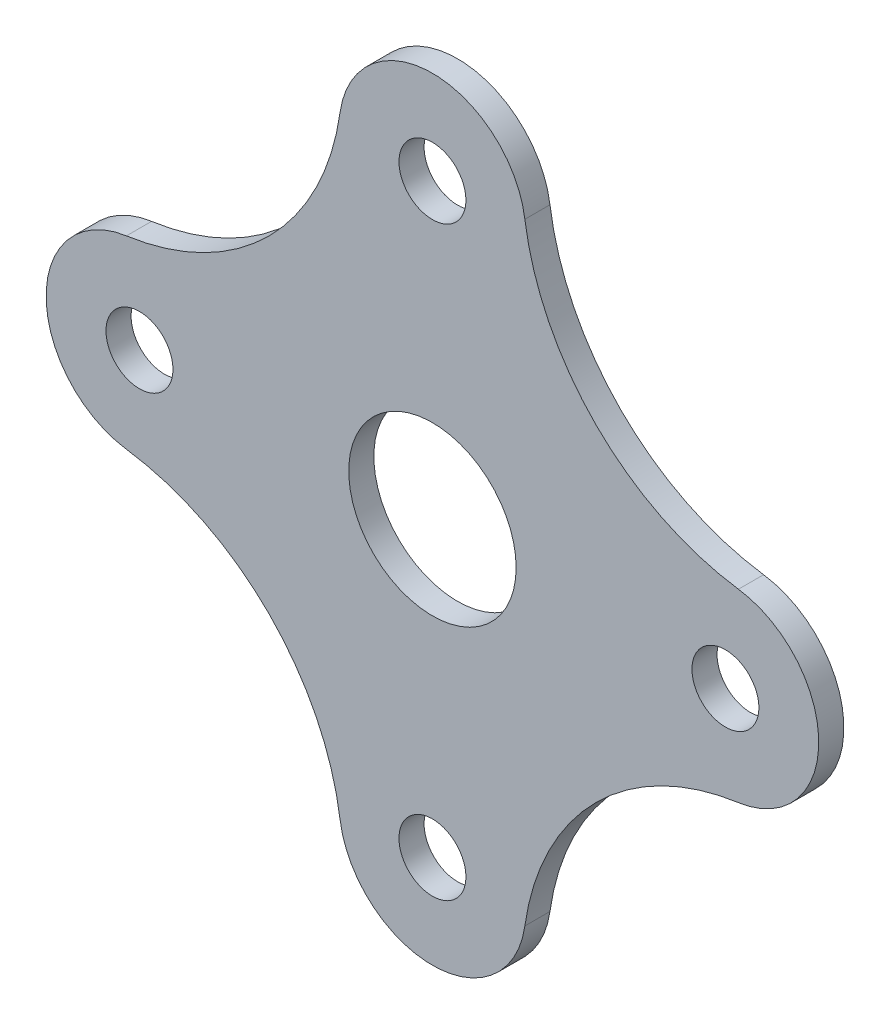
ISO-10303-21;
HEADER;
FILE_DESCRIPTION(('STEP AP214'),'2;1');
FILE_NAME('part.step','',(''),(''),'','','');
FILE_SCHEMA(('AUTOMOTIVE_DESIGN { 1 0 10303 214 1 1 1 1 }'));
ENDSEC;
DATA;
#1=APPLICATION_CONTEXT('core data for automotive mechanical design processes');
#2=APPLICATION_PROTOCOL_DEFINITION('international standard','automotive_design',2000,#1);
#3=PRODUCT_CONTEXT('',#1,'mechanical');
#4=PRODUCT('Part','Part','',(#3));
#5=PRODUCT_RELATED_PRODUCT_CATEGORY('part','',(#4));
#6=PRODUCT_DEFINITION_FORMATION('','',#4);
#7=PRODUCT_DEFINITION_CONTEXT('part definition',#1,'design');
#8=PRODUCT_DEFINITION('design','',#6,#7);
#9=PRODUCT_DEFINITION_SHAPE('','',#8);
#10=(LENGTH_UNIT() NAMED_UNIT(*) SI_UNIT(.MILLI.,.METRE.));
#11=(NAMED_UNIT(*) PLANE_ANGLE_UNIT() SI_UNIT($,.RADIAN.));
#12=(NAMED_UNIT(*) SI_UNIT($,.STERADIAN.) SOLID_ANGLE_UNIT());
#13=UNCERTAINTY_MEASURE_WITH_UNIT(LENGTH_MEASURE(1.E-05),#10,'distance_accuracy_value','');
#14=(GEOMETRIC_REPRESENTATION_CONTEXT(3) GLOBAL_UNCERTAINTY_ASSIGNED_CONTEXT((#13)) GLOBAL_UNIT_ASSIGNED_CONTEXT((#10,
#11,#12)) REPRESENTATION_CONTEXT('',''));
#15=CARTESIAN_POINT('',(0.,0.,0.));
#16=DIRECTION('',(0.,0.,1.));
#17=DIRECTION('',(1.,0.,0.));
#18=AXIS2_PLACEMENT_3D('',#15,#16,#17);
#19=CARTESIAN_POINT('',(0.,-35.,3.));
#20=DIRECTION('',(0.,0.,1.));
#21=DIRECTION('',(1.,0.,0.));
#22=AXIS2_PLACEMENT_3D('',#19,#20,#21);
#23=PLANE('',#22);
#24=CARTESIAN_POINT('',(0.,-35.,3.));
#25=DIRECTION('',(0.,0.,1.));
#26=DIRECTION('',(1.,0.,0.));
#27=AXIS2_PLACEMENT_3D('',#24,#25,#26);
#28=CIRCLE('',#27,4.);
#29=CARTESIAN_POINT('',(4.,-35.,3.));
#30=VERTEX_POINT('',#29);
#31=EDGE_CURVE('E196',#30,#30,#28,.T.);
#32=ORIENTED_EDGE('',*,*,#31,.F.);
#33=EDGE_LOOP('',(#32));
#34=FACE_BOUND('',#33,.T.);
#35=CARTESIAN_POINT('',(35.,0.,3.));
#36=DIRECTION('',(0.,0.,1.));
#37=DIRECTION('',(1.,0.,0.));
#38=AXIS2_PLACEMENT_3D('',#35,#36,#37);
#39=CIRCLE('',#38,4.00000000000001);
#40=CARTESIAN_POINT('',(39.,0.,3.));
#41=VERTEX_POINT('',#40);
#42=EDGE_CURVE('E185',#41,#41,#39,.T.);
#43=ORIENTED_EDGE('',*,*,#42,.F.);
#44=EDGE_LOOP('',(#43));
#45=FACE_BOUND('',#44,.T.);
#46=CARTESIAN_POINT('',(-35.,0.,3.));
#47=DIRECTION('',(0.,0.,1.));
#48=DIRECTION('',(1.,0.,0.));
#49=AXIS2_PLACEMENT_3D('',#46,#47,#48);
#50=CIRCLE('',#49,11.1495844875346);
#51=CARTESIAN_POINT('',(-36.5569960811462,11.040335024263,3.));
#52=VERTEX_POINT('',#51);
#53=CARTESIAN_POINT('',(-36.5569960811462,-11.040335024263,3.));
#54=VERTEX_POINT('',#53);
#55=EDGE_CURVE('E120',#52,#54,#50,.T.);
#56=ORIENTED_EDGE('',*,*,#55,.T.);
#57=CARTESIAN_POINT('',(-40.7463793255719,-40.7463793255719,3.));
#58=DIRECTION('',(0.,0.,1.));
#59=DIRECTION('',(1.,0.,0.));
#60=AXIS2_PLACEMENT_3D('',#57,#58,#59);
#61=CIRCLE('',#60,30.);
#62=CARTESIAN_POINT('',(-11.040335024263,-36.5569960811462,3.));
#63=VERTEX_POINT('',#62);
#64=EDGE_CURVE('E11',#54,#63,#61,.F.);
#65=ORIENTED_EDGE('',*,*,#64,.T.);
#66=CARTESIAN_POINT('',(0.,-35.,3.));
#67=DIRECTION('',(0.,0.,1.));
#68=DIRECTION('',(1.,0.,0.));
#69=AXIS2_PLACEMENT_3D('',#66,#67,#68);
#70=CIRCLE('',#69,11.1495844875346);
#71=CARTESIAN_POINT('',(11.040335024263,-36.5569960811462,3.));
#72=VERTEX_POINT('',#71);
#73=EDGE_CURVE('E127',#63,#72,#70,.T.);
#74=ORIENTED_EDGE('',*,*,#73,.T.);
#75=CARTESIAN_POINT('',(40.7463793255719,-40.7463793255719,3.));
#76=DIRECTION('',(0.,0.,1.));
#77=DIRECTION('',(1.,0.,0.));
#78=AXIS2_PLACEMENT_3D('',#75,#76,#77);
#79=CIRCLE('',#78,30.);
#80=CARTESIAN_POINT('',(36.5569960811462,-11.040335024263,3.));
#81=VERTEX_POINT('',#80);
#82=EDGE_CURVE('E156',#72,#81,#79,.F.);
#83=ORIENTED_EDGE('',*,*,#82,.T.);
#84=CARTESIAN_POINT('',(35.,0.,3.));
#85=DIRECTION('',(0.,0.,1.));
#86=DIRECTION('',(1.,0.,0.));
#87=AXIS2_PLACEMENT_3D('',#84,#85,#86);
#88=CIRCLE('',#87,11.1495844875346);
#89=CARTESIAN_POINT('',(36.5569960811462,11.040335024263,3.));
#90=VERTEX_POINT('',#89);
#91=EDGE_CURVE('E130',#81,#90,#88,.T.);
#92=ORIENTED_EDGE('',*,*,#91,.T.);
#93=CARTESIAN_POINT('',(40.7463793255719,40.7463793255719,3.));
#94=DIRECTION('',(0.,0.,1.));
#95=DIRECTION('',(1.,0.,0.));
#96=AXIS2_PLACEMENT_3D('',#93,#94,#95);
#97=CIRCLE('',#96,30.);
#98=CARTESIAN_POINT('',(11.040335024263,36.5569960811462,3.));
#99=VERTEX_POINT('',#98);
#100=EDGE_CURVE('E152',#90,#99,#97,.F.);
#101=ORIENTED_EDGE('',*,*,#100,.T.);
#102=CARTESIAN_POINT('',(0.,35.,3.));
#103=DIRECTION('',(0.,0.,1.));
#104=DIRECTION('',(1.,0.,0.));
#105=AXIS2_PLACEMENT_3D('',#102,#103,#104);
#106=CIRCLE('',#105,11.1495844875346);
#107=CARTESIAN_POINT('',(-11.040335024263,36.5569960811462,3.));
#108=VERTEX_POINT('',#107);
#109=EDGE_CURVE('E169',#99,#108,#106,.T.);
#110=ORIENTED_EDGE('',*,*,#109,.T.);
#111=CARTESIAN_POINT('',(-40.7463793255719,40.7463793255719,3.));
#112=DIRECTION('',(0.,0.,1.));
#113=DIRECTION('',(1.,0.,0.));
#114=AXIS2_PLACEMENT_3D('',#111,#112,#113);
#115=CIRCLE('',#114,30.);
#116=EDGE_CURVE('E112',#108,#52,#115,.F.);
#117=ORIENTED_EDGE('',*,*,#116,.T.);
#118=EDGE_LOOP('',(#56,#65,#74,#83,#92,#101,#110,#117));
#119=FACE_BOUND('',#118,.T.);
#120=CARTESIAN_POINT('',(-35.,0.,3.));
#121=DIRECTION('',(0.,0.,1.));
#122=DIRECTION('',(1.,0.,0.));
#123=AXIS2_PLACEMENT_3D('',#120,#121,#122);
#124=CIRCLE('',#123,4.00000000000001);
#125=CARTESIAN_POINT('',(-31.,0.,3.));
#126=VERTEX_POINT('',#125);
#127=EDGE_CURVE('E175',#126,#126,#124,.T.);
#128=ORIENTED_EDGE('',*,*,#127,.F.);
#129=EDGE_LOOP('',(#128));
#130=FACE_BOUND('',#129,.T.);
#131=CARTESIAN_POINT('',(0.,35.,3.));
#132=DIRECTION('',(0.,0.,1.));
#133=DIRECTION('',(1.,0.,0.));
#134=AXIS2_PLACEMENT_3D('',#131,#132,#133);
#135=CIRCLE('',#134,4.);
#136=CARTESIAN_POINT('',(3.99999999999999,35.,3.));
#137=VERTEX_POINT('',#136);
#138=EDGE_CURVE('E190',#137,#137,#135,.T.);
#139=ORIENTED_EDGE('',*,*,#138,.F.);
#140=EDGE_LOOP('',(#139));
#141=FACE_BOUND('',#140,.T.);
#142=CARTESIAN_POINT('',(0.,0.,3.));
#143=DIRECTION('',(0.,0.,1.));
#144=DIRECTION('',(1.,0.,0.));
#145=AXIS2_PLACEMENT_3D('',#142,#143,#144);
#146=CIRCLE('',#145,10.);
#147=CARTESIAN_POINT('',(9.99999999999999,0.,3.));
#148=VERTEX_POINT('',#147);
#149=EDGE_CURVE('E202',#148,#148,#146,.T.);
#150=ORIENTED_EDGE('',*,*,#149,.F.);
#151=EDGE_LOOP('',(#150));
#152=FACE_BOUND('',#151,.T.);
#153=ADVANCED_FACE('F37',(#34,#45,#119,#130,#141,#152),#23,.T.);
#154=CARTESIAN_POINT('',(0.,-35.,0.));
#155=DIRECTION('',(0.,0.,1.));
#156=DIRECTION('',(1.,0.,0.));
#157=AXIS2_PLACEMENT_3D('',#154,#155,#156);
#158=PLANE('',#157);
#159=CARTESIAN_POINT('',(0.,-35.,0.));
#160=DIRECTION('',(0.,0.,1.));
#161=DIRECTION('',(1.,0.,0.));
#162=AXIS2_PLACEMENT_3D('',#159,#160,#161);
#163=CIRCLE('',#162,11.1495844875346);
#164=CARTESIAN_POINT('',(-11.040335024263,-36.5569960811462,0.));
#165=VERTEX_POINT('',#164);
#166=CARTESIAN_POINT('',(11.040335024263,-36.5569960811462,0.));
#167=VERTEX_POINT('',#166);
#168=EDGE_CURVE('E172',#165,#167,#163,.T.);
#169=ORIENTED_EDGE('',*,*,#168,.F.);
#170=CARTESIAN_POINT('',(-40.7463793255719,-40.7463793255719,0.));
#171=DIRECTION('',(0.,0.,1.));
#172=DIRECTION('',(1.,0.,0.));
#173=AXIS2_PLACEMENT_3D('',#170,#171,#172);
#174=CIRCLE('',#173,30.);
#175=CARTESIAN_POINT('',(-36.5569960811462,-11.040335024263,0.));
#176=VERTEX_POINT('',#175);
#177=EDGE_CURVE('E45',#165,#176,#174,.T.);
#178=ORIENTED_EDGE('',*,*,#177,.T.);
#179=CARTESIAN_POINT('',(-35.,0.,0.));
#180=DIRECTION('',(0.,0.,1.));
#181=DIRECTION('',(1.,0.,0.));
#182=AXIS2_PLACEMENT_3D('',#179,#180,#181);
#183=CIRCLE('',#182,11.1495844875346);
#184=CARTESIAN_POINT('',(-36.5569960811462,11.040335024263,0.));
#185=VERTEX_POINT('',#184);
#186=EDGE_CURVE('E118',#185,#176,#183,.T.);
#187=ORIENTED_EDGE('',*,*,#186,.F.);
#188=CARTESIAN_POINT('',(-40.7463793255719,40.7463793255719,0.));
#189=DIRECTION('',(0.,0.,1.));
#190=DIRECTION('',(1.,0.,0.));
#191=AXIS2_PLACEMENT_3D('',#188,#189,#190);
#192=CIRCLE('',#191,30.);
#193=CARTESIAN_POINT('',(-11.040335024263,36.5569960811462,0.));
#194=VERTEX_POINT('',#193);
#195=EDGE_CURVE('E102',#185,#194,#192,.T.);
#196=ORIENTED_EDGE('',*,*,#195,.T.);
#197=CARTESIAN_POINT('',(0.,35.,0.));
#198=DIRECTION('',(0.,0.,1.));
#199=DIRECTION('',(1.,0.,0.));
#200=AXIS2_PLACEMENT_3D('',#197,#198,#199);
#201=CIRCLE('',#200,11.1495844875346);
#202=CARTESIAN_POINT('',(11.040335024263,36.5569960811462,0.));
#203=VERTEX_POINT('',#202);
#204=EDGE_CURVE('E128',#203,#194,#201,.T.);
#205=ORIENTED_EDGE('',*,*,#204,.F.);
#206=CARTESIAN_POINT('',(40.7463793255719,40.7463793255719,0.));
#207=DIRECTION('',(0.,0.,1.));
#208=DIRECTION('',(1.,0.,0.));
#209=AXIS2_PLACEMENT_3D('',#206,#207,#208);
#210=CIRCLE('',#209,30.);
#211=CARTESIAN_POINT('',(36.5569960811462,11.040335024263,0.));
#212=VERTEX_POINT('',#211);
#213=EDGE_CURVE('E150',#203,#212,#210,.T.);
#214=ORIENTED_EDGE('',*,*,#213,.T.);
#215=CARTESIAN_POINT('',(35.,0.,0.));
#216=DIRECTION('',(0.,0.,1.));
#217=DIRECTION('',(1.,0.,0.));
#218=AXIS2_PLACEMENT_3D('',#215,#216,#217);
#219=CIRCLE('',#218,11.1495844875346);
#220=CARTESIAN_POINT('',(36.5569960811462,-11.040335024263,0.));
#221=VERTEX_POINT('',#220);
#222=EDGE_CURVE('E132',#221,#212,#219,.T.);
#223=ORIENTED_EDGE('',*,*,#222,.F.);
#224=CARTESIAN_POINT('',(40.7463793255719,-40.7463793255719,0.));
#225=DIRECTION('',(0.,0.,1.));
#226=DIRECTION('',(1.,0.,0.));
#227=AXIS2_PLACEMENT_3D('',#224,#225,#226);
#228=CIRCLE('',#227,30.);
#229=EDGE_CURVE('E154',#221,#167,#228,.T.);
#230=ORIENTED_EDGE('',*,*,#229,.T.);
#231=EDGE_LOOP('',(#169,#178,#187,#196,#205,#214,#223,#230));
#232=FACE_BOUND('',#231,.T.);
#233=CARTESIAN_POINT('',(-35.,0.,0.));
#234=DIRECTION('',(0.,0.,1.));
#235=DIRECTION('',(1.,0.,0.));
#236=AXIS2_PLACEMENT_3D('',#233,#234,#235);
#237=CIRCLE('',#236,4.00000000000001);
#238=CARTESIAN_POINT('',(-31.,0.,0.));
#239=VERTEX_POINT('',#238);
#240=EDGE_CURVE('E178',#239,#239,#237,.T.);
#241=ORIENTED_EDGE('',*,*,#240,.T.);
#242=EDGE_LOOP('',(#241));
#243=FACE_BOUND('',#242,.T.);
#244=CARTESIAN_POINT('',(35.,0.,0.));
#245=DIRECTION('',(0.,0.,1.));
#246=DIRECTION('',(1.,0.,0.));
#247=AXIS2_PLACEMENT_3D('',#244,#245,#246);
#248=CIRCLE('',#247,4.00000000000001);
#249=CARTESIAN_POINT('',(39.,0.,0.));
#250=VERTEX_POINT('',#249);
#251=EDGE_CURVE('E187',#250,#250,#248,.T.);
#252=ORIENTED_EDGE('',*,*,#251,.T.);
#253=EDGE_LOOP('',(#252));
#254=FACE_BOUND('',#253,.T.);
#255=CARTESIAN_POINT('',(0.,35.,0.));
#256=DIRECTION('',(0.,0.,1.));
#257=DIRECTION('',(1.,0.,0.));
#258=AXIS2_PLACEMENT_3D('',#255,#256,#257);
#259=CIRCLE('',#258,4.);
#260=CARTESIAN_POINT('',(3.99999999999999,35.,0.));
#261=VERTEX_POINT('',#260);
#262=EDGE_CURVE('E193',#261,#261,#259,.T.);
#263=ORIENTED_EDGE('',*,*,#262,.T.);
#264=EDGE_LOOP('',(#263));
#265=FACE_BOUND('',#264,.T.);
#266=CARTESIAN_POINT('',(0.,-35.,0.));
#267=DIRECTION('',(0.,0.,1.));
#268=DIRECTION('',(1.,0.,0.));
#269=AXIS2_PLACEMENT_3D('',#266,#267,#268);
#270=CIRCLE('',#269,4.);
#271=CARTESIAN_POINT('',(4.,-35.,0.));
#272=VERTEX_POINT('',#271);
#273=EDGE_CURVE('E199',#272,#272,#270,.T.);
#274=ORIENTED_EDGE('',*,*,#273,.T.);
#275=EDGE_LOOP('',(#274));
#276=FACE_BOUND('',#275,.T.);
#277=CARTESIAN_POINT('',(0.,0.,0.));
#278=DIRECTION('',(0.,0.,1.));
#279=DIRECTION('',(1.,0.,0.));
#280=AXIS2_PLACEMENT_3D('',#277,#278,#279);
#281=CIRCLE('',#280,10.);
#282=CARTESIAN_POINT('',(9.99999999999999,0.,0.));
#283=VERTEX_POINT('',#282);
#284=EDGE_CURVE('E205',#283,#283,#281,.T.);
#285=ORIENTED_EDGE('',*,*,#284,.T.);
#286=EDGE_LOOP('',(#285));
#287=FACE_BOUND('',#286,.T.);
#288=ADVANCED_FACE('F125',(#232,#243,#254,#265,#276,#287),#158,.F.);
#289=CARTESIAN_POINT('',(0.,-35.,3.));
#290=DIRECTION('',(0.,0.,-1.));
#291=DIRECTION('',(-1.,0.,0.));
#292=AXIS2_PLACEMENT_3D('',#289,#290,#291);
#293=CYLINDRICAL_SURFACE('',#292,11.1495844875346);
#294=ORIENTED_EDGE('',*,*,#168,.T.);
#295=DIRECTION('',(0.,0.,-1.));
#296=VECTOR('',#295,1.);
#297=CARTESIAN_POINT('',(11.040335024263,-36.5569960811462,3.));
#298=LINE('',#297,#296);
#299=EDGE_CURVE('E52',#167,#72,#298,.F.);
#300=ORIENTED_EDGE('',*,*,#299,.T.);
#301=ORIENTED_EDGE('',*,*,#73,.F.);
#302=DIRECTION('',(0.,0.,-1.));
#303=VECTOR('',#302,1.);
#304=CARTESIAN_POINT('',(-11.040335024263,-36.5569960811462,3.));
#305=LINE('',#304,#303);
#306=EDGE_CURVE('E145',#63,#165,#305,.T.);
#307=ORIENTED_EDGE('',*,*,#306,.T.);
#308=EDGE_LOOP('',(#294,#300,#301,#307));
#309=FACE_BOUND('',#308,.T.);
#310=ADVANCED_FACE('F173',(#309),#293,.T.);
#311=CARTESIAN_POINT('',(35.,0.,3.));
#312=DIRECTION('',(0.,0.,-1.));
#313=DIRECTION('',(-1.,0.,0.));
#314=AXIS2_PLACEMENT_3D('',#311,#312,#313);
#315=CYLINDRICAL_SURFACE('',#314,11.1495844875346);
#316=ORIENTED_EDGE('',*,*,#222,.T.);
#317=DIRECTION('',(0.,0.,-1.));
#318=VECTOR('',#317,1.);
#319=CARTESIAN_POINT('',(36.5569960811462,11.040335024263,3.));
#320=LINE('',#319,#318);
#321=EDGE_CURVE('E143',#212,#90,#320,.F.);
#322=ORIENTED_EDGE('',*,*,#321,.T.);
#323=ORIENTED_EDGE('',*,*,#91,.F.);
#324=DIRECTION('',(0.,0.,-1.));
#325=VECTOR('',#324,1.);
#326=CARTESIAN_POINT('',(36.5569960811462,-11.040335024263,3.));
#327=LINE('',#326,#325);
#328=EDGE_CURVE('E140',#81,#221,#327,.T.);
#329=ORIENTED_EDGE('',*,*,#328,.T.);
#330=EDGE_LOOP('',(#316,#322,#323,#329));
#331=FACE_BOUND('',#330,.T.);
#332=ADVANCED_FACE('F166',(#331),#315,.T.);
#333=CARTESIAN_POINT('',(0.,35.,3.));
#334=DIRECTION('',(0.,0.,-1.));
#335=DIRECTION('',(-1.,0.,0.));
#336=AXIS2_PLACEMENT_3D('',#333,#334,#335);
#337=CYLINDRICAL_SURFACE('',#336,11.1495844875346);
#338=ORIENTED_EDGE('',*,*,#204,.T.);
#339=DIRECTION('',(0.,0.,-1.));
#340=VECTOR('',#339,1.);
#341=CARTESIAN_POINT('',(-11.040335024263,36.5569960811462,3.));
#342=LINE('',#341,#340);
#343=EDGE_CURVE('E107',#194,#108,#342,.F.);
#344=ORIENTED_EDGE('',*,*,#343,.T.);
#345=ORIENTED_EDGE('',*,*,#109,.F.);
#346=DIRECTION('',(0.,0.,-1.));
#347=VECTOR('',#346,1.);
#348=CARTESIAN_POINT('',(11.040335024263,36.5569960811462,3.));
#349=LINE('',#348,#347);
#350=EDGE_CURVE('E121',#99,#203,#349,.T.);
#351=ORIENTED_EDGE('',*,*,#350,.T.);
#352=EDGE_LOOP('',(#338,#344,#345,#351));
#353=FACE_BOUND('',#352,.T.);
#354=ADVANCED_FACE('F229',(#353),#337,.T.);
#355=CARTESIAN_POINT('',(-35.,0.,3.));
#356=DIRECTION('',(0.,0.,-1.));
#357=DIRECTION('',(-1.,0.,0.));
#358=AXIS2_PLACEMENT_3D('',#355,#356,#357);
#359=CYLINDRICAL_SURFACE('',#358,11.1495844875346);
#360=ORIENTED_EDGE('',*,*,#55,.F.);
#361=DIRECTION('',(0.,0.,-1.));
#362=VECTOR('',#361,1.);
#363=CARTESIAN_POINT('',(-36.5569960811462,11.040335024263,3.));
#364=LINE('',#363,#362);
#365=EDGE_CURVE('E106',#52,#185,#364,.T.);
#366=ORIENTED_EDGE('',*,*,#365,.T.);
#367=ORIENTED_EDGE('',*,*,#186,.T.);
#368=DIRECTION('',(0.,0.,-1.));
#369=VECTOR('',#368,1.);
#370=CARTESIAN_POINT('',(-36.5569960811462,-11.040335024263,3.));
#371=LINE('',#370,#369);
#372=EDGE_CURVE('E122',#176,#54,#371,.F.);
#373=ORIENTED_EDGE('',*,*,#372,.T.);
#374=EDGE_LOOP('',(#360,#366,#367,#373));
#375=FACE_BOUND('',#374,.T.);
#376=ADVANCED_FACE('F117',(#375),#359,.T.);
#377=CARTESIAN_POINT('',(-35.,0.,3.));
#378=DIRECTION('',(0.,0.,-1.));
#379=DIRECTION('',(-1.,0.,0.));
#380=AXIS2_PLACEMENT_3D('',#377,#378,#379);
#381=CYLINDRICAL_SURFACE('',#380,4.00000000000001);
#382=ORIENTED_EDGE('',*,*,#127,.T.);
#383=EDGE_LOOP('',(#382));
#384=FACE_BOUND('',#383,.T.);
#385=ORIENTED_EDGE('',*,*,#240,.F.);
#386=EDGE_LOOP('',(#385));
#387=FACE_BOUND('',#386,.T.);
#388=ADVANCED_FACE('F224',(#384,#387),#381,.F.);
#389=CARTESIAN_POINT('',(35.,0.,3.));
#390=DIRECTION('',(0.,0.,-1.));
#391=DIRECTION('',(-1.,0.,0.));
#392=AXIS2_PLACEMENT_3D('',#389,#390,#391);
#393=CYLINDRICAL_SURFACE('',#392,4.00000000000001);
#394=ORIENTED_EDGE('',*,*,#42,.T.);
#395=EDGE_LOOP('',(#394));
#396=FACE_BOUND('',#395,.T.);
#397=ORIENTED_EDGE('',*,*,#251,.F.);
#398=EDGE_LOOP('',(#397));
#399=FACE_BOUND('',#398,.T.);
#400=ADVANCED_FACE('F343',(#396,#399),#393,.F.);
#401=CARTESIAN_POINT('',(0.,35.,3.));
#402=DIRECTION('',(0.,0.,-1.));
#403=DIRECTION('',(-1.,0.,0.));
#404=AXIS2_PLACEMENT_3D('',#401,#402,#403);
#405=CYLINDRICAL_SURFACE('',#404,4.);
#406=ORIENTED_EDGE('',*,*,#138,.T.);
#407=EDGE_LOOP('',(#406));
#408=FACE_BOUND('',#407,.T.);
#409=ORIENTED_EDGE('',*,*,#262,.F.);
#410=EDGE_LOOP('',(#409));
#411=FACE_BOUND('',#410,.T.);
#412=ADVANCED_FACE('F332',(#408,#411),#405,.F.);
#413=CARTESIAN_POINT('',(0.,-35.,3.));
#414=DIRECTION('',(0.,0.,-1.));
#415=DIRECTION('',(-1.,0.,0.));
#416=AXIS2_PLACEMENT_3D('',#413,#414,#415);
#417=CYLINDRICAL_SURFACE('',#416,4.);
#418=ORIENTED_EDGE('',*,*,#31,.T.);
#419=EDGE_LOOP('',(#418));
#420=FACE_BOUND('',#419,.T.);
#421=ORIENTED_EDGE('',*,*,#273,.F.);
#422=EDGE_LOOP('',(#421));
#423=FACE_BOUND('',#422,.T.);
#424=ADVANCED_FACE('F322',(#420,#423),#417,.F.);
#425=CARTESIAN_POINT('',(0.,0.,3.));
#426=DIRECTION('',(0.,0.,-1.));
#427=DIRECTION('',(-1.,0.,0.));
#428=AXIS2_PLACEMENT_3D('',#425,#426,#427);
#429=CYLINDRICAL_SURFACE('',#428,10.);
#430=ORIENTED_EDGE('',*,*,#149,.T.);
#431=EDGE_LOOP('',(#430));
#432=FACE_BOUND('',#431,.T.);
#433=ORIENTED_EDGE('',*,*,#284,.F.);
#434=EDGE_LOOP('',(#433));
#435=FACE_BOUND('',#434,.T.);
#436=ADVANCED_FACE('F211',(#432,#435),#429,.F.);
#437=CARTESIAN_POINT('',(-40.7463793255719,40.7463793255719,3.));
#438=DIRECTION('',(0.,0.,1.));
#439=DIRECTION('',(1.,0.,0.));
#440=AXIS2_PLACEMENT_3D('',#437,#438,#439);
#441=CYLINDRICAL_SURFACE('',#440,30.);
#442=ORIENTED_EDGE('',*,*,#116,.F.);
#443=ORIENTED_EDGE('',*,*,#343,.F.);
#444=ORIENTED_EDGE('',*,*,#195,.F.);
#445=ORIENTED_EDGE('',*,*,#365,.F.);
#446=EDGE_LOOP('',(#442,#443,#444,#445));
#447=FACE_BOUND('',#446,.T.);
#448=ADVANCED_FACE('F105',(#447),#441,.F.);
#449=CARTESIAN_POINT('',(40.7463793255719,40.7463793255719,3.));
#450=DIRECTION('',(0.,0.,1.));
#451=DIRECTION('',(1.,0.,0.));
#452=AXIS2_PLACEMENT_3D('',#449,#450,#451);
#453=CYLINDRICAL_SURFACE('',#452,30.);
#454=ORIENTED_EDGE('',*,*,#100,.F.);
#455=ORIENTED_EDGE('',*,*,#321,.F.);
#456=ORIENTED_EDGE('',*,*,#213,.F.);
#457=ORIENTED_EDGE('',*,*,#350,.F.);
#458=EDGE_LOOP('',(#454,#455,#456,#457));
#459=FACE_BOUND('',#458,.T.);
#460=ADVANCED_FACE('F239',(#459),#453,.F.);
#461=CARTESIAN_POINT('',(40.7463793255719,-40.7463793255719,3.));
#462=DIRECTION('',(0.,0.,1.));
#463=DIRECTION('',(1.,0.,0.));
#464=AXIS2_PLACEMENT_3D('',#461,#462,#463);
#465=CYLINDRICAL_SURFACE('',#464,30.);
#466=ORIENTED_EDGE('',*,*,#82,.F.);
#467=ORIENTED_EDGE('',*,*,#299,.F.);
#468=ORIENTED_EDGE('',*,*,#229,.F.);
#469=ORIENTED_EDGE('',*,*,#328,.F.);
#470=EDGE_LOOP('',(#466,#467,#468,#469));
#471=FACE_BOUND('',#470,.T.);
#472=ADVANCED_FACE('F171',(#471),#465,.F.);
#473=CARTESIAN_POINT('',(-40.7463793255719,-40.7463793255719,3.));
#474=DIRECTION('',(0.,0.,1.));
#475=DIRECTION('',(1.,0.,0.));
#476=AXIS2_PLACEMENT_3D('',#473,#474,#475);
#477=CYLINDRICAL_SURFACE('',#476,30.);
#478=ORIENTED_EDGE('',*,*,#64,.F.);
#479=ORIENTED_EDGE('',*,*,#372,.F.);
#480=ORIENTED_EDGE('',*,*,#177,.F.);
#481=ORIENTED_EDGE('',*,*,#306,.F.);
#482=EDGE_LOOP('',(#478,#479,#480,#481));
#483=FACE_BOUND('',#482,.T.);
#484=ADVANCED_FACE('F39',(#483),#477,.F.);
#485=CLOSED_SHELL('',(#153,#288,#310,#332,#354,#376,#388,#400,#412,#424,#436,#448,#460,#472,#484));
#486=MANIFOLD_SOLID_BREP('B2',#485);
#487=ADVANCED_BREP_SHAPE_REPRESENTATION('',(#18,#486),#14);
#488=SHAPE_DEFINITION_REPRESENTATION(#9,#487);
ENDSEC;
END-ISO-10303-21;
